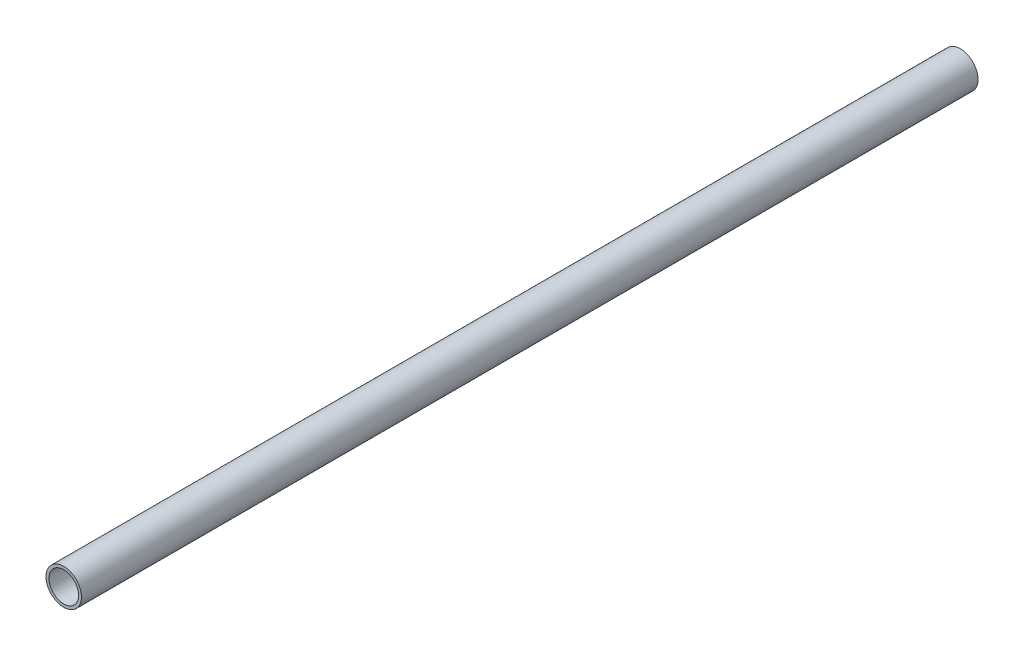
ISO-10303-21;
HEADER;
FILE_DESCRIPTION(('STEP AP214'),'2;1');
FILE_NAME('part.step','',(''),(''),'','','');
FILE_SCHEMA(('AUTOMOTIVE_DESIGN { 1 0 10303 214 1 1 1 1 }'));
ENDSEC;
DATA;
#1=APPLICATION_CONTEXT('core data for automotive mechanical design processes');
#2=APPLICATION_PROTOCOL_DEFINITION('international standard','automotive_design',2000,#1);
#3=PRODUCT_CONTEXT('',#1,'mechanical');
#4=PRODUCT('Part','Part','',(#3));
#5=PRODUCT_RELATED_PRODUCT_CATEGORY('part','',(#4));
#6=PRODUCT_DEFINITION_FORMATION('','',#4);
#7=PRODUCT_DEFINITION_CONTEXT('part definition',#1,'design');
#8=PRODUCT_DEFINITION('design','',#6,#7);
#9=PRODUCT_DEFINITION_SHAPE('','',#8);
#10=(LENGTH_UNIT() NAMED_UNIT(*) SI_UNIT(.MILLI.,.METRE.));
#11=(NAMED_UNIT(*) PLANE_ANGLE_UNIT() SI_UNIT($,.RADIAN.));
#12=(NAMED_UNIT(*) SI_UNIT($,.STERADIAN.) SOLID_ANGLE_UNIT());
#13=UNCERTAINTY_MEASURE_WITH_UNIT(LENGTH_MEASURE(1.E-05),#10,'distance_accuracy_value','');
#14=(GEOMETRIC_REPRESENTATION_CONTEXT(3) GLOBAL_UNCERTAINTY_ASSIGNED_CONTEXT((#13)) GLOBAL_UNIT_ASSIGNED_CONTEXT((#10,
#11,#12)) REPRESENTATION_CONTEXT('',''));
#15=CARTESIAN_POINT('',(0.,0.,0.));
#16=DIRECTION('',(0.,0.,1.));
#17=DIRECTION('',(1.,0.,0.));
#18=AXIS2_PLACEMENT_3D('',#15,#16,#17);
#19=CARTESIAN_POINT('',(0.,0.,1219.2));
#20=DIRECTION('',(0.,0.,1.));
#21=DIRECTION('',(1.,0.,0.));
#22=AXIS2_PLACEMENT_3D('',#19,#20,#21);
#23=PLANE('',#22);
#24=CARTESIAN_POINT('',(0.,0.,1219.2));
#25=DIRECTION('',(0.,0.,1.));
#26=DIRECTION('',(1.,0.,0.));
#27=AXIS2_PLACEMENT_3D('',#24,#25,#26);
#28=CIRCLE('',#27,24.13);
#29=CARTESIAN_POINT('',(-24.13,0.,1219.2));
#30=VERTEX_POINT('',#29);
#31=EDGE_CURVE('E10',#30,#30,#28,.T.);
#32=ORIENTED_EDGE('',*,*,#31,.T.);
#33=EDGE_LOOP('',(#32));
#34=FACE_BOUND('',#33,.T.);
#35=CARTESIAN_POINT('',(0.,0.,1219.2));
#36=DIRECTION('',(0.,0.,1.));
#37=DIRECTION('',(1.,0.,0.));
#38=AXIS2_PLACEMENT_3D('',#35,#36,#37);
#39=CIRCLE('',#38,20.193);
#40=CARTESIAN_POINT('',(-20.193,0.,1219.2));
#41=VERTEX_POINT('',#40);
#42=EDGE_CURVE('E47',#41,#41,#39,.T.);
#43=ORIENTED_EDGE('',*,*,#42,.F.);
#44=EDGE_LOOP('',(#43));
#45=FACE_BOUND('',#44,.T.);
#46=ADVANCED_FACE('F35',(#34,#45),#23,.T.);
#47=CARTESIAN_POINT('',(0.,0.,0.));
#48=DIRECTION('',(0.,0.,1.));
#49=DIRECTION('',(1.,0.,0.));
#50=AXIS2_PLACEMENT_3D('',#47,#48,#49);
#51=PLANE('',#50);
#52=CARTESIAN_POINT('',(0.,0.,0.));
#53=DIRECTION('',(0.,0.,1.));
#54=DIRECTION('',(1.,0.,0.));
#55=AXIS2_PLACEMENT_3D('',#52,#53,#54);
#56=CIRCLE('',#55,24.13);
#57=CARTESIAN_POINT('',(-24.13,0.,0.));
#58=VERTEX_POINT('',#57);
#59=EDGE_CURVE('E39',#58,#58,#56,.T.);
#60=ORIENTED_EDGE('',*,*,#59,.F.);
#61=EDGE_LOOP('',(#60));
#62=FACE_BOUND('',#61,.T.);
#63=CARTESIAN_POINT('',(0.,0.,0.));
#64=DIRECTION('',(0.,0.,1.));
#65=DIRECTION('',(1.,0.,0.));
#66=AXIS2_PLACEMENT_3D('',#63,#64,#65);
#67=CIRCLE('',#66,20.193);
#68=CARTESIAN_POINT('',(-20.193,0.,0.));
#69=VERTEX_POINT('',#68);
#70=EDGE_CURVE('E49',#69,#69,#67,.T.);
#71=ORIENTED_EDGE('',*,*,#70,.T.);
#72=EDGE_LOOP('',(#71));
#73=FACE_BOUND('',#72,.T.);
#74=ADVANCED_FACE('F60',(#62,#73),#51,.F.);
#75=CARTESIAN_POINT('',(0.,0.,1219.2));
#76=DIRECTION('',(0.,0.,-1.));
#77=DIRECTION('',(-1.,0.,0.));
#78=AXIS2_PLACEMENT_3D('',#75,#76,#77);
#79=CYLINDRICAL_SURFACE('',#78,24.13);
#80=CARTESIAN_POINT('',(-24.13,0.,1219.2));
#81=CARTESIAN_POINT('',(-24.13,0.,1206.5));
#82=CARTESIAN_POINT('',(-24.13,0.,1193.8));
#83=CARTESIAN_POINT('',(-24.13,0.,1168.4));
#84=CARTESIAN_POINT('',(-24.13,0.,1155.7));
#85=CARTESIAN_POINT('',(-24.13,0.,1130.3));
#86=CARTESIAN_POINT('',(-24.13,0.,1117.6));
#87=CARTESIAN_POINT('',(-24.13,0.,1092.2));
#88=CARTESIAN_POINT('',(-24.13,0.,1079.5));
#89=CARTESIAN_POINT('',(-24.13,0.,1054.1));
#90=CARTESIAN_POINT('',(-24.13,0.,1041.4));
#91=CARTESIAN_POINT('',(-24.13,0.,1016.));
#92=CARTESIAN_POINT('',(-24.13,0.,1003.3));
#93=CARTESIAN_POINT('',(-24.13,0.,977.9));
#94=CARTESIAN_POINT('',(-24.13,0.,965.2));
#95=CARTESIAN_POINT('',(-24.13,0.,939.8));
#96=CARTESIAN_POINT('',(-24.13,0.,927.1));
#97=CARTESIAN_POINT('',(-24.13,0.,901.7));
#98=CARTESIAN_POINT('',(-24.13,0.,889.));
#99=CARTESIAN_POINT('',(-24.13,0.,863.6));
#100=CARTESIAN_POINT('',(-24.13,0.,850.9));
#101=CARTESIAN_POINT('',(-24.13,0.,825.5));
#102=CARTESIAN_POINT('',(-24.13,0.,812.8));
#103=CARTESIAN_POINT('',(-24.13,0.,787.4));
#104=CARTESIAN_POINT('',(-24.13,0.,774.7));
#105=CARTESIAN_POINT('',(-24.13,0.,749.3));
#106=CARTESIAN_POINT('',(-24.13,0.,736.6));
#107=CARTESIAN_POINT('',(-24.13,0.,711.2));
#108=CARTESIAN_POINT('',(-24.13,0.,698.5));
#109=CARTESIAN_POINT('',(-24.13,0.,673.1));
#110=CARTESIAN_POINT('',(-24.13,0.,660.4));
#111=CARTESIAN_POINT('',(-24.13,0.,635.));
#112=CARTESIAN_POINT('',(-24.13,0.,622.3));
#113=CARTESIAN_POINT('',(-24.13,0.,596.9));
#114=CARTESIAN_POINT('',(-24.13,0.,584.2));
#115=CARTESIAN_POINT('',(-24.13,0.,558.8));
#116=CARTESIAN_POINT('',(-24.13,0.,546.1));
#117=CARTESIAN_POINT('',(-24.13,0.,520.7));
#118=CARTESIAN_POINT('',(-24.13,0.,508.));
#119=CARTESIAN_POINT('',(-24.13,0.,482.6));
#120=CARTESIAN_POINT('',(-24.13,0.,469.9));
#121=CARTESIAN_POINT('',(-24.13,0.,444.5));
#122=CARTESIAN_POINT('',(-24.13,0.,431.8));
#123=CARTESIAN_POINT('',(-24.13,0.,406.4));
#124=CARTESIAN_POINT('',(-24.13,0.,393.7));
#125=CARTESIAN_POINT('',(-24.13,0.,368.3));
#126=CARTESIAN_POINT('',(-24.13,0.,355.6));
#127=CARTESIAN_POINT('',(-24.13,0.,330.2));
#128=CARTESIAN_POINT('',(-24.13,0.,317.5));
#129=CARTESIAN_POINT('',(-24.13,0.,292.1));
#130=CARTESIAN_POINT('',(-24.13,0.,279.4));
#131=CARTESIAN_POINT('',(-24.13,0.,254.));
#132=CARTESIAN_POINT('',(-24.13,0.,241.3));
#133=CARTESIAN_POINT('',(-24.13,0.,215.9));
#134=CARTESIAN_POINT('',(-24.13,0.,203.2));
#135=CARTESIAN_POINT('',(-24.13,0.,177.8));
#136=CARTESIAN_POINT('',(-24.13,0.,165.1));
#137=CARTESIAN_POINT('',(-24.13,0.,139.7));
#138=CARTESIAN_POINT('',(-24.13,0.,127.));
#139=CARTESIAN_POINT('',(-24.13,0.,101.6));
#140=CARTESIAN_POINT('',(-24.13,0.,88.9));
#141=CARTESIAN_POINT('',(-24.13,0.,63.5));
#142=CARTESIAN_POINT('',(-24.13,0.,50.8));
#143=CARTESIAN_POINT('',(-24.13,0.,25.4));
#144=CARTESIAN_POINT('',(-24.13,0.,12.7));
#145=CARTESIAN_POINT('',(-24.13,0.,0.));
#146=B_SPLINE_CURVE_WITH_KNOTS('',3,(#80,#81,#82,#83,#84,#85,#86,#87,#88,#89,#90,#91,#92,#93,
#94,#95,#96,#97,#98,#99,#100,#101,#102,#103,#104,#105,#106,#107,#108,#109,#110,#111,#112,#113,
#114,#115,#116,#117,#118,#119,#120,#121,#122,#123,#124,#125,#126,#127,#128,#129,#130,#131,#132,
#133,#134,#135,#136,#137,#138,#139,#140,#141,#142,#143,#144,#145),.UNSPECIFIED.,.F.,.F.,(4,2,2,
2,2,2,2,2,2,2,2,2,2,2,2,2,2,2,2,2,2,2,2,2,2,2,2,2,2,2,2,2,4),(0.,38.1,76.2,114.3,152.4,190.5,
228.6,266.7,304.8,342.9,381.,419.1,457.2,495.3,533.4,571.5,609.6,647.7,685.8,723.9,762.,800.1,
838.2,876.3,914.4,952.5,990.6,1028.7,1066.8,1104.9,1143.,1181.1,1219.2),.UNSPECIFIED.);
#147=EDGE_CURVE('BSEAM37',#30,#58,#146,.T.);
#148=ORIENTED_EDGE('',*,*,#31,.F.);
#149=ORIENTED_EDGE('',*,*,#59,.T.);
#150=ORIENTED_EDGE('',*,*,#147,.T.);
#151=ORIENTED_EDGE('',*,*,#147,.F.);
#152=EDGE_LOOP('',(#148,#150,#149,#151));
#153=FACE_BOUND('',#152,.T.);
#154=ADVANCED_FACE('F37',(#153),#79,.T.);
#155=CARTESIAN_POINT('',(0.,0.,1219.2));
#156=DIRECTION('',(0.,0.,-1.));
#157=DIRECTION('',(-1.,0.,0.));
#158=AXIS2_PLACEMENT_3D('',#155,#156,#157);
#159=CYLINDRICAL_SURFACE('',#158,20.193);
#160=CARTESIAN_POINT('',(-20.193,0.,1219.2));
#161=CARTESIAN_POINT('',(-20.193,0.,1206.5));
#162=CARTESIAN_POINT('',(-20.193,0.,1193.8));
#163=CARTESIAN_POINT('',(-20.193,0.,1168.4));
#164=CARTESIAN_POINT('',(-20.193,0.,1155.7));
#165=CARTESIAN_POINT('',(-20.193,0.,1130.3));
#166=CARTESIAN_POINT('',(-20.193,0.,1117.6));
#167=CARTESIAN_POINT('',(-20.193,0.,1092.2));
#168=CARTESIAN_POINT('',(-20.193,0.,1079.5));
#169=CARTESIAN_POINT('',(-20.193,0.,1054.1));
#170=CARTESIAN_POINT('',(-20.193,0.,1041.4));
#171=CARTESIAN_POINT('',(-20.193,0.,1016.));
#172=CARTESIAN_POINT('',(-20.193,0.,1003.3));
#173=CARTESIAN_POINT('',(-20.193,0.,977.9));
#174=CARTESIAN_POINT('',(-20.193,0.,965.2));
#175=CARTESIAN_POINT('',(-20.193,0.,939.8));
#176=CARTESIAN_POINT('',(-20.193,0.,927.1));
#177=CARTESIAN_POINT('',(-20.193,0.,901.7));
#178=CARTESIAN_POINT('',(-20.193,0.,889.));
#179=CARTESIAN_POINT('',(-20.193,0.,863.6));
#180=CARTESIAN_POINT('',(-20.193,0.,850.9));
#181=CARTESIAN_POINT('',(-20.193,0.,825.5));
#182=CARTESIAN_POINT('',(-20.193,0.,812.8));
#183=CARTESIAN_POINT('',(-20.193,0.,787.4));
#184=CARTESIAN_POINT('',(-20.193,0.,774.7));
#185=CARTESIAN_POINT('',(-20.193,0.,749.3));
#186=CARTESIAN_POINT('',(-20.193,0.,736.6));
#187=CARTESIAN_POINT('',(-20.193,0.,711.2));
#188=CARTESIAN_POINT('',(-20.193,0.,698.5));
#189=CARTESIAN_POINT('',(-20.193,0.,673.1));
#190=CARTESIAN_POINT('',(-20.193,0.,660.4));
#191=CARTESIAN_POINT('',(-20.193,0.,635.));
#192=CARTESIAN_POINT('',(-20.193,0.,622.3));
#193=CARTESIAN_POINT('',(-20.193,0.,596.9));
#194=CARTESIAN_POINT('',(-20.193,0.,584.2));
#195=CARTESIAN_POINT('',(-20.193,0.,558.8));
#196=CARTESIAN_POINT('',(-20.193,0.,546.1));
#197=CARTESIAN_POINT('',(-20.193,0.,520.7));
#198=CARTESIAN_POINT('',(-20.193,0.,508.));
#199=CARTESIAN_POINT('',(-20.193,0.,482.6));
#200=CARTESIAN_POINT('',(-20.193,0.,469.9));
#201=CARTESIAN_POINT('',(-20.193,0.,444.5));
#202=CARTESIAN_POINT('',(-20.193,0.,431.8));
#203=CARTESIAN_POINT('',(-20.193,0.,406.4));
#204=CARTESIAN_POINT('',(-20.193,0.,393.7));
#205=CARTESIAN_POINT('',(-20.193,0.,368.3));
#206=CARTESIAN_POINT('',(-20.193,0.,355.6));
#207=CARTESIAN_POINT('',(-20.193,0.,330.2));
#208=CARTESIAN_POINT('',(-20.193,0.,317.5));
#209=CARTESIAN_POINT('',(-20.193,0.,292.1));
#210=CARTESIAN_POINT('',(-20.193,0.,279.4));
#211=CARTESIAN_POINT('',(-20.193,0.,254.));
#212=CARTESIAN_POINT('',(-20.193,0.,241.3));
#213=CARTESIAN_POINT('',(-20.193,0.,215.9));
#214=CARTESIAN_POINT('',(-20.193,0.,203.2));
#215=CARTESIAN_POINT('',(-20.193,0.,177.8));
#216=CARTESIAN_POINT('',(-20.193,0.,165.1));
#217=CARTESIAN_POINT('',(-20.193,0.,139.7));
#218=CARTESIAN_POINT('',(-20.193,0.,127.));
#219=CARTESIAN_POINT('',(-20.193,0.,101.6));
#220=CARTESIAN_POINT('',(-20.193,0.,88.9));
#221=CARTESIAN_POINT('',(-20.193,0.,63.5));
#222=CARTESIAN_POINT('',(-20.193,0.,50.8));
#223=CARTESIAN_POINT('',(-20.193,0.,25.4));
#224=CARTESIAN_POINT('',(-20.193,0.,12.7));
#225=CARTESIAN_POINT('',(-20.193,0.,0.));
#226=B_SPLINE_CURVE_WITH_KNOTS('',3,(#160,#161,#162,#163,#164,#165,#166,#167,#168,#169,#170,
#171,#172,#173,#174,#175,#176,#177,#178,#179,#180,#181,#182,#183,#184,#185,#186,#187,#188,#189,
#190,#191,#192,#193,#194,#195,#196,#197,#198,#199,#200,#201,#202,#203,#204,#205,#206,#207,#208,
#209,#210,#211,#212,#213,#214,#215,#216,#217,#218,#219,#220,#221,#222,#223,#224,#225),
.UNSPECIFIED.,.F.,.F.,(4,2,2,2,2,2,2,2,2,2,2,2,2,2,2,2,2,2,2,2,2,2,2,2,2,2,2,2,2,2,2,2,4),(0.,
38.0999999999998,76.1999999999998,114.3,152.4,190.5,228.6,266.7,304.8,342.9,381.,419.1,457.2,
495.3,533.4,571.5,609.6,647.7,685.8,723.9,762.,800.1,838.2,876.3,914.4,952.5,990.6,1028.7,
1066.8,1104.9,1143.,1181.1,1219.2),.UNSPECIFIED.);
#227=EDGE_CURVE('BSEAM56',#41,#69,#226,.T.);
#228=ORIENTED_EDGE('',*,*,#42,.T.);
#229=ORIENTED_EDGE('',*,*,#70,.F.);
#230=ORIENTED_EDGE('',*,*,#227,.T.);
#231=ORIENTED_EDGE('',*,*,#227,.F.);
#232=EDGE_LOOP('',(#228,#230,#229,#231));
#233=FACE_BOUND('',#232,.T.);
#234=ADVANCED_FACE('F56',(#233),#159,.F.);
#235=CLOSED_SHELL('',(#46,#74,#154,#234));
#236=MANIFOLD_SOLID_BREP('B2',#235);
#237=ADVANCED_BREP_SHAPE_REPRESENTATION('',(#18,#236),#14);
#238=SHAPE_DEFINITION_REPRESENTATION(#9,#237);
ENDSEC;
END-ISO-10303-21;
